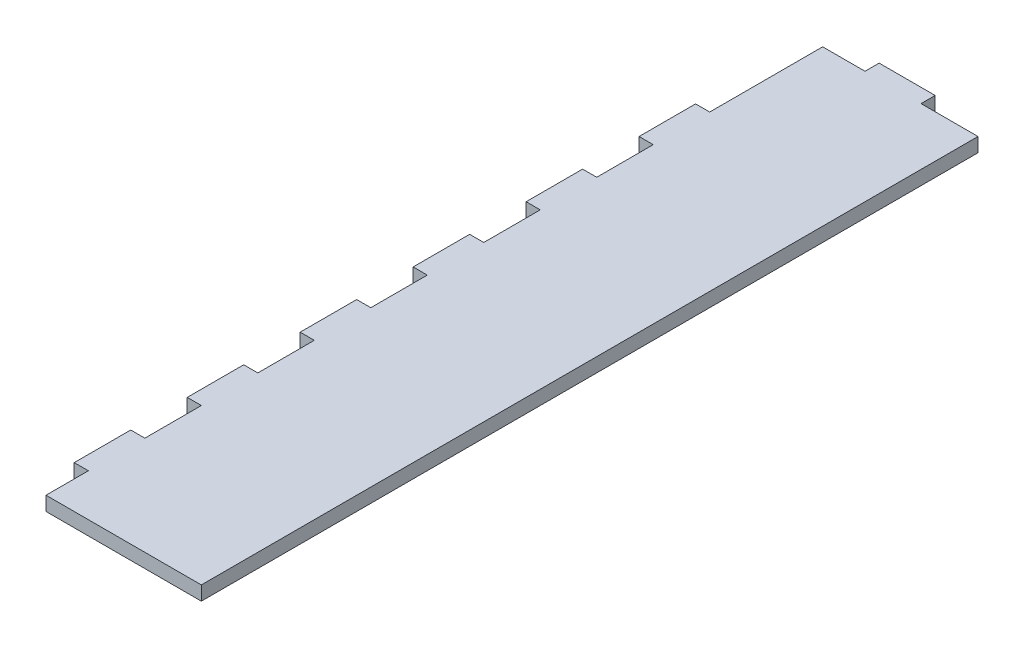
ISO-10303-21;
HEADER;
FILE_DESCRIPTION(('STEP AP214'),'2;1');
FILE_NAME('part.step','',(''),(''),'','','');
FILE_SCHEMA(('AUTOMOTIVE_DESIGN { 1 0 10303 214 1 1 1 1 }'));
ENDSEC;
DATA;
#1=APPLICATION_CONTEXT('core data for automotive mechanical design processes');
#2=APPLICATION_PROTOCOL_DEFINITION('international standard','automotive_design',2000,#1);
#3=PRODUCT_CONTEXT('',#1,'mechanical');
#4=PRODUCT('Part','Part','',(#3));
#5=PRODUCT_RELATED_PRODUCT_CATEGORY('part','',(#4));
#6=PRODUCT_DEFINITION_FORMATION('','',#4);
#7=PRODUCT_DEFINITION_CONTEXT('part definition',#1,'design');
#8=PRODUCT_DEFINITION('design','',#6,#7);
#9=PRODUCT_DEFINITION_SHAPE('','',#8);
#10=(LENGTH_UNIT() NAMED_UNIT(*) SI_UNIT(.MILLI.,.METRE.));
#11=(NAMED_UNIT(*) PLANE_ANGLE_UNIT() SI_UNIT($,.RADIAN.));
#12=(NAMED_UNIT(*) SI_UNIT($,.STERADIAN.) SOLID_ANGLE_UNIT());
#13=UNCERTAINTY_MEASURE_WITH_UNIT(LENGTH_MEASURE(1.E-05),#10,'distance_accuracy_value','');
#14=(GEOMETRIC_REPRESENTATION_CONTEXT(3) GLOBAL_UNCERTAINTY_ASSIGNED_CONTEXT((#13)) GLOBAL_UNIT_ASSIGNED_CONTEXT((#10,
#11,#12)) REPRESENTATION_CONTEXT('',''));
#15=CARTESIAN_POINT('',(0.,0.,0.));
#16=DIRECTION('',(0.,0.,1.));
#17=DIRECTION('',(1.,0.,0.));
#18=AXIS2_PLACEMENT_3D('',#15,#16,#17);
#19=CARTESIAN_POINT('',(-19.05,3.175,88.9));
#20=DIRECTION('',(1.,0.,0.));
#21=DIRECTION('',(0.,0.,-1.));
#22=AXIS2_PLACEMENT_3D('',#19,#20,#21);
#23=PLANE('',#22);
#24=DIRECTION('',(0.,0.,1.));
#25=VECTOR('',#24,1.);
#26=CARTESIAN_POINT('',(-19.05,0.,88.9));
#27=LINE('',#26,#25);
#28=CARTESIAN_POINT('',(-19.05,0.,-60.3249999999999));
#29=VERTEX_POINT('',#28);
#30=CARTESIAN_POINT('',(-19.05,0.,-47.6249999999999));
#31=VERTEX_POINT('',#30);
#32=EDGE_CURVE('E273',#29,#31,#27,.T.);
#33=ORIENTED_EDGE('',*,*,#32,.T.);
#34=DIRECTION('',(0.,1.,0.));
#35=VECTOR('',#34,1.);
#36=CARTESIAN_POINT('',(-19.05,0.,-47.6249999999999));
#37=LINE('',#36,#35);
#38=CARTESIAN_POINT('',(-19.05,3.175,-47.6249999999999));
#39=VERTEX_POINT('',#38);
#40=EDGE_CURVE('E382',#31,#39,#37,.T.);
#41=ORIENTED_EDGE('',*,*,#40,.T.);
#42=DIRECTION('',(0.,0.,1.));
#43=VECTOR('',#42,1.);
#44=CARTESIAN_POINT('',(-19.05,3.175,88.9));
#45=LINE('',#44,#43);
#46=CARTESIAN_POINT('',(-19.05,3.175,-60.3249999999999));
#47=VERTEX_POINT('',#46);
#48=EDGE_CURVE('E296',#47,#39,#45,.T.);
#49=ORIENTED_EDGE('',*,*,#48,.F.);
#50=DIRECTION('',(0.,1.,0.));
#51=VECTOR('',#50,1.);
#52=CARTESIAN_POINT('',(-19.05,0.,-60.3249999999999));
#53=LINE('',#52,#51);
#54=EDGE_CURVE('E470',#29,#47,#53,.T.);
#55=ORIENTED_EDGE('',*,*,#54,.F.);
#56=EDGE_LOOP('',(#33,#41,#49,#55));
#57=FACE_BOUND('',#56,.T.);
#58=ADVANCED_FACE('F33',(#57),#23,.F.);
#59=CARTESIAN_POINT('',(-19.05,3.175,-34.9249999999999));
#60=VERTEX_POINT('',#59);
#61=CARTESIAN_POINT('',(-19.0499999999997,3.175,-22.2249999999999));
#62=VERTEX_POINT('',#61);
#63=EDGE_CURVE('E307',#60,#62,#45,.T.);
#64=ORIENTED_EDGE('',*,*,#63,.F.);
#65=DIRECTION('',(0.,1.,0.));
#66=VECTOR('',#65,1.);
#67=CARTESIAN_POINT('',(-19.05,0.,-34.9249999999999));
#68=LINE('',#67,#66);
#69=CARTESIAN_POINT('',(-19.05,0.,-34.9249999999999));
#70=VERTEX_POINT('',#69);
#71=EDGE_CURVE('E399',#70,#60,#68,.T.);
#72=ORIENTED_EDGE('',*,*,#71,.F.);
#73=CARTESIAN_POINT('',(-19.0499999999997,0.,-22.2249999999999));
#74=VERTEX_POINT('',#73);
#75=EDGE_CURVE('E269',#70,#74,#27,.T.);
#76=ORIENTED_EDGE('',*,*,#75,.T.);
#77=DIRECTION('',(0.,1.,0.));
#78=VECTOR('',#77,1.);
#79=CARTESIAN_POINT('',(-19.0499999999997,0.,-22.2249999999999));
#80=LINE('',#79,#78);
#81=EDGE_CURVE('E442',#74,#62,#80,.T.);
#82=ORIENTED_EDGE('',*,*,#81,.T.);
#83=EDGE_LOOP('',(#64,#72,#76,#82));
#84=FACE_BOUND('',#83,.T.);
#85=ADVANCED_FACE('F503',(#84),#23,.F.);
#86=CARTESIAN_POINT('',(-19.0499999999997,3.175,-9.52499999999994));
#87=VERTEX_POINT('',#86);
#88=CARTESIAN_POINT('',(-19.0499999999995,3.175,3.17500000000005));
#89=VERTEX_POINT('',#88);
#90=EDGE_CURVE('E313',#87,#89,#45,.T.);
#91=ORIENTED_EDGE('',*,*,#90,.F.);
#92=DIRECTION('',(0.,1.,0.));
#93=VECTOR('',#92,1.);
#94=CARTESIAN_POINT('',(-19.0499999999997,0.,-9.52499999999994));
#95=LINE('',#94,#93);
#96=CARTESIAN_POINT('',(-19.0499999999997,0.,-9.52499999999994));
#97=VERTEX_POINT('',#96);
#98=EDGE_CURVE('E268',#97,#87,#95,.T.);
#99=ORIENTED_EDGE('',*,*,#98,.F.);
#100=CARTESIAN_POINT('',(-19.0499999999995,0.,3.17500000000005));
#101=VERTEX_POINT('',#100);
#102=EDGE_CURVE('E261',#97,#101,#27,.T.);
#103=ORIENTED_EDGE('',*,*,#102,.T.);
#104=DIRECTION('',(0.,1.,0.));
#105=VECTOR('',#104,1.);
#106=CARTESIAN_POINT('',(-19.0499999999995,0.,3.17500000000005));
#107=LINE('',#106,#105);
#108=EDGE_CURVE('E242',#101,#89,#107,.T.);
#109=ORIENTED_EDGE('',*,*,#108,.T.);
#110=EDGE_LOOP('',(#91,#99,#103,#109));
#111=FACE_BOUND('',#110,.T.);
#112=ADVANCED_FACE('F267',(#111),#23,.F.);
#113=CARTESIAN_POINT('',(-19.0499999999995,3.175,15.8750000000001));
#114=VERTEX_POINT('',#113);
#115=CARTESIAN_POINT('',(-19.0499999999992,3.175,28.575));
#116=VERTEX_POINT('',#115);
#117=EDGE_CURVE('E302',#114,#116,#45,.T.);
#118=ORIENTED_EDGE('',*,*,#117,.F.);
#119=DIRECTION('',(0.,1.,0.));
#120=VECTOR('',#119,1.);
#121=CARTESIAN_POINT('',(-19.0499999999995,0.,15.8750000000001));
#122=LINE('',#121,#120);
#123=CARTESIAN_POINT('',(-19.0499999999995,0.,15.8750000000001));
#124=VERTEX_POINT('',#123);
#125=EDGE_CURVE('E253',#124,#114,#122,.T.);
#126=ORIENTED_EDGE('',*,*,#125,.F.);
#127=CARTESIAN_POINT('',(-19.0499999999992,0.,28.575));
#128=VERTEX_POINT('',#127);
#129=EDGE_CURVE('E270',#124,#128,#27,.T.);
#130=ORIENTED_EDGE('',*,*,#129,.T.);
#131=DIRECTION('',(0.,1.,0.));
#132=VECTOR('',#131,1.);
#133=CARTESIAN_POINT('',(-19.0499999999992,0.,28.575));
#134=LINE('',#133,#132);
#135=EDGE_CURVE('E334',#128,#116,#134,.T.);
#136=ORIENTED_EDGE('',*,*,#135,.T.);
#137=EDGE_LOOP('',(#118,#126,#130,#136));
#138=FACE_BOUND('',#137,.T.);
#139=ADVANCED_FACE('F332',(#138),#23,.F.);
#140=CARTESIAN_POINT('',(-19.0499999999992,3.175,41.275));
#141=VERTEX_POINT('',#140);
#142=CARTESIAN_POINT('',(-19.0499999999989,3.175,53.9750000000001));
#143=VERTEX_POINT('',#142);
#144=EDGE_CURVE('E294',#141,#143,#45,.T.);
#145=ORIENTED_EDGE('',*,*,#144,.F.);
#146=DIRECTION('',(0.,1.,0.));
#147=VECTOR('',#146,1.);
#148=CARTESIAN_POINT('',(-19.0499999999992,0.,41.275));
#149=LINE('',#148,#147);
#150=CARTESIAN_POINT('',(-19.0499999999992,0.,41.275));
#151=VERTEX_POINT('',#150);
#152=EDGE_CURVE('E338',#151,#141,#149,.T.);
#153=ORIENTED_EDGE('',*,*,#152,.F.);
#154=CARTESIAN_POINT('',(-19.0499999999989,0.,53.9750000000001));
#155=VERTEX_POINT('',#154);
#156=EDGE_CURVE('E275',#151,#155,#27,.T.);
#157=ORIENTED_EDGE('',*,*,#156,.T.);
#158=DIRECTION('',(0.,1.,0.));
#159=VECTOR('',#158,1.);
#160=CARTESIAN_POINT('',(-19.0499999999989,0.,53.9750000000001));
#161=LINE('',#160,#159);
#162=EDGE_CURVE('E358',#155,#143,#161,.T.);
#163=ORIENTED_EDGE('',*,*,#162,.T.);
#164=EDGE_LOOP('',(#145,#153,#157,#163));
#165=FACE_BOUND('',#164,.T.);
#166=ADVANCED_FACE('F531',(#165),#23,.F.);
#167=CARTESIAN_POINT('',(-19.0499999999989,0.,66.6750000000001));
#168=VERTEX_POINT('',#167);
#169=CARTESIAN_POINT('',(-19.0499999999987,0.,79.3750000000001));
#170=VERTEX_POINT('',#169);
#171=EDGE_CURVE('E276',#168,#170,#27,.T.);
#172=ORIENTED_EDGE('',*,*,#171,.T.);
#173=DIRECTION('',(0.,1.,0.));
#174=VECTOR('',#173,1.);
#175=CARTESIAN_POINT('',(-19.0499999999987,0.,79.3750000000001));
#176=LINE('',#175,#174);
#177=CARTESIAN_POINT('',(-19.0499999999987,3.175,79.3750000000001));
#178=VERTEX_POINT('',#177);
#179=EDGE_CURVE('E404',#170,#178,#176,.T.);
#180=ORIENTED_EDGE('',*,*,#179,.T.);
#181=CARTESIAN_POINT('',(-19.0499999999989,3.175,66.6750000000001));
#182=VERTEX_POINT('',#181);
#183=EDGE_CURVE('E288',#182,#178,#45,.T.);
#184=ORIENTED_EDGE('',*,*,#183,.F.);
#185=DIRECTION('',(0.,1.,0.));
#186=VECTOR('',#185,1.);
#187=CARTESIAN_POINT('',(-19.0499999999989,0.,66.6750000000001));
#188=LINE('',#187,#186);
#189=EDGE_CURVE('E370',#168,#182,#188,.T.);
#190=ORIENTED_EDGE('',*,*,#189,.F.);
#191=EDGE_LOOP('',(#172,#180,#184,#190));
#192=FACE_BOUND('',#191,.T.);
#193=ADVANCED_FACE('F35',(#192),#23,.F.);
#194=CARTESIAN_POINT('',(19.05,3.175,88.9));
#195=DIRECTION('',(0.,0.,-1.));
#196=DIRECTION('',(-1.,0.,0.));
#197=AXIS2_PLACEMENT_3D('',#194,#195,#196);
#198=PLANE('',#197);
#199=DIRECTION('',(1.,0.,0.));
#200=VECTOR('',#199,1.);
#201=CARTESIAN_POINT('',(19.05,3.175,88.9));
#202=LINE('',#201,#200);
#203=CARTESIAN_POINT('',(-15.8749999999987,3.175,88.9));
#204=VERTEX_POINT('',#203);
#205=CARTESIAN_POINT('',(19.05,3.175,88.9));
#206=VERTEX_POINT('',#205);
#207=EDGE_CURVE('E306',#204,#206,#202,.T.);
#208=ORIENTED_EDGE('',*,*,#207,.F.);
#209=DIRECTION('',(0.,1.,0.));
#210=VECTOR('',#209,1.);
#211=CARTESIAN_POINT('',(-15.8749999999987,0.,88.9));
#212=LINE('',#211,#210);
#213=CARTESIAN_POINT('',(-15.8749999999987,0.,88.9));
#214=VERTEX_POINT('',#213);
#215=EDGE_CURVE('E422',#214,#204,#212,.T.);
#216=ORIENTED_EDGE('',*,*,#215,.F.);
#217=DIRECTION('',(1.,0.,0.));
#218=VECTOR('',#217,1.);
#219=CARTESIAN_POINT('',(19.05,0.,88.9));
#220=LINE('',#219,#218);
#221=CARTESIAN_POINT('',(19.05,0.,88.9));
#222=VERTEX_POINT('',#221);
#223=EDGE_CURVE('E282',#214,#222,#220,.T.);
#224=ORIENTED_EDGE('',*,*,#223,.T.);
#225=DIRECTION('',(0.,-1.,0.));
#226=VECTOR('',#225,1.);
#227=CARTESIAN_POINT('',(19.05,3.175,88.9));
#228=LINE('',#227,#226);
#229=EDGE_CURVE('E11',#206,#222,#228,.T.);
#230=ORIENTED_EDGE('',*,*,#229,.F.);
#231=EDGE_LOOP('',(#208,#216,#224,#230));
#232=FACE_BOUND('',#231,.T.);
#233=ADVANCED_FACE('F530',(#232),#198,.F.);
#234=CARTESIAN_POINT('',(19.05,3.175,88.9));
#235=DIRECTION('',(-1.,0.,0.));
#236=DIRECTION('',(0.,0.,1.));
#237=AXIS2_PLACEMENT_3D('',#234,#235,#236);
#238=PLANE('',#237);
#239=DIRECTION('',(0.,0.,-1.));
#240=VECTOR('',#239,1.);
#241=CARTESIAN_POINT('',(19.05,0.,88.9));
#242=LINE('',#241,#240);
#243=CARTESIAN_POINT('',(19.05,0.,-85.725));
#244=VERTEX_POINT('',#243);
#245=EDGE_CURVE('E284',#222,#244,#242,.T.);
#246=ORIENTED_EDGE('',*,*,#245,.T.);
#247=DIRECTION('',(0.,1.,0.));
#248=VECTOR('',#247,1.);
#249=CARTESIAN_POINT('',(19.05,0.,-85.725));
#250=LINE('',#249,#248);
#251=CARTESIAN_POINT('',(19.05,3.175,-85.725));
#252=VERTEX_POINT('',#251);
#253=EDGE_CURVE('E384',#244,#252,#250,.T.);
#254=ORIENTED_EDGE('',*,*,#253,.T.);
#255=DIRECTION('',(0.,0.,-1.));
#256=VECTOR('',#255,1.);
#257=CARTESIAN_POINT('',(19.05,3.175,88.9));
#258=LINE('',#257,#256);
#259=EDGE_CURVE('E311',#206,#252,#258,.T.);
#260=ORIENTED_EDGE('',*,*,#259,.F.);
#261=ORIENTED_EDGE('',*,*,#229,.T.);
#262=EDGE_LOOP('',(#246,#254,#260,#261));
#263=FACE_BOUND('',#262,.T.);
#264=ADVANCED_FACE('F537',(#263),#238,.F.);
#265=CARTESIAN_POINT('',(19.05,3.175,-88.8999999999999));
#266=DIRECTION('',(0.,0.,1.));
#267=DIRECTION('',(1.,0.,0.));
#268=AXIS2_PLACEMENT_3D('',#265,#266,#267);
#269=PLANE('',#268);
#270=DIRECTION('',(-1.,0.,0.));
#271=VECTOR('',#270,1.);
#272=CARTESIAN_POINT('',(19.05,3.175,-88.8999999999999));
#273=LINE('',#272,#271);
#274=CARTESIAN_POINT('',(6.24073442661703,3.175,-88.8999999999999));
#275=VERTEX_POINT('',#274);
#276=CARTESIAN_POINT('',(-6.34999999999999,3.175,-88.8999999999999));
#277=VERTEX_POINT('',#276);
#278=EDGE_CURVE('E41',#275,#277,#273,.T.);
#279=ORIENTED_EDGE('',*,*,#278,.F.);
#280=DIRECTION('',(0.,1.,0.));
#281=VECTOR('',#280,1.);
#282=CARTESIAN_POINT('',(6.24073442661703,0.,-88.8999999999999));
#283=LINE('',#282,#281);
#284=CARTESIAN_POINT('',(6.24073442661703,0.,-88.8999999999999));
#285=VERTEX_POINT('',#284);
#286=EDGE_CURVE('E378',#285,#275,#283,.T.);
#287=ORIENTED_EDGE('',*,*,#286,.F.);
#288=DIRECTION('',(-1.,0.,0.));
#289=VECTOR('',#288,1.);
#290=CARTESIAN_POINT('',(19.05,0.,-88.8999999999999));
#291=LINE('',#290,#289);
#292=CARTESIAN_POINT('',(-6.34999999999999,0.,-88.8999999999999));
#293=VERTEX_POINT('',#292);
#294=EDGE_CURVE('E286',#285,#293,#291,.T.);
#295=ORIENTED_EDGE('',*,*,#294,.T.);
#296=DIRECTION('',(0.,1.,0.));
#297=VECTOR('',#296,1.);
#298=CARTESIAN_POINT('',(-6.34999999999999,0.,-88.8999999999999));
#299=LINE('',#298,#297);
#300=EDGE_CURVE('E280',#293,#277,#299,.T.);
#301=ORIENTED_EDGE('',*,*,#300,.T.);
#302=EDGE_LOOP('',(#279,#287,#295,#301));
#303=FACE_BOUND('',#302,.T.);
#304=ADVANCED_FACE('F557',(#303),#269,.F.);
#305=CARTESIAN_POINT('',(0.,3.175,0.));
#306=DIRECTION('',(0.,1.,0.));
#307=DIRECTION('',(0.,0.,1.));
#308=AXIS2_PLACEMENT_3D('',#305,#306,#307);
#309=PLANE('',#308);
#310=DIRECTION('',(1.,0.,0.));
#311=VECTOR('',#310,1.);
#312=CARTESIAN_POINT('',(6.24073442661703,3.175,-85.725));
#313=LINE('',#312,#311);
#314=CARTESIAN_POINT('',(6.24073442661703,3.175,-85.725));
#315=VERTEX_POINT('',#314);
#316=EDGE_CURVE('E376',#315,#252,#313,.T.);
#317=ORIENTED_EDGE('',*,*,#316,.F.);
#318=DIRECTION('',(0.,0.,1.));
#319=VECTOR('',#318,1.);
#320=CARTESIAN_POINT('',(6.24073442661703,3.175,-88.8999999999999));
#321=LINE('',#320,#319);
#322=EDGE_CURVE('E379',#275,#315,#321,.T.);
#323=ORIENTED_EDGE('',*,*,#322,.F.);
#324=ORIENTED_EDGE('',*,*,#278,.T.);
#325=DIRECTION('',(0.,0.,-1.));
#326=VECTOR('',#325,1.);
#327=CARTESIAN_POINT('',(-6.34999999999999,3.175,-88.8999999999999));
#328=LINE('',#327,#326);
#329=CARTESIAN_POINT('',(-6.34999999999999,3.175,-85.725));
#330=VERTEX_POINT('',#329);
#331=EDGE_CURVE('E461',#330,#277,#328,.T.);
#332=ORIENTED_EDGE('',*,*,#331,.F.);
#333=DIRECTION('',(1.,0.,0.));
#334=VECTOR('',#333,1.);
#335=CARTESIAN_POINT('',(-6.34999999999999,3.175,-85.725));
#336=LINE('',#335,#334);
#337=CARTESIAN_POINT('',(-15.875,3.175,-85.7249999999999));
#338=VERTEX_POINT('',#337);
#339=EDGE_CURVE('E476',#338,#330,#336,.T.);
#340=ORIENTED_EDGE('',*,*,#339,.F.);
#341=DIRECTION('',(0.,0.,-1.));
#342=VECTOR('',#341,1.);
#343=CARTESIAN_POINT('',(-15.875,3.175,-85.7249999999999));
#344=LINE('',#343,#342);
#345=CARTESIAN_POINT('',(-15.875,3.175,-60.3249999999999));
#346=VERTEX_POINT('',#345);
#347=EDGE_CURVE('E473',#346,#338,#344,.T.);
#348=ORIENTED_EDGE('',*,*,#347,.F.);
#349=DIRECTION('',(1.,0.,0.));
#350=VECTOR('',#349,1.);
#351=CARTESIAN_POINT('',(-19.05,3.175,-60.3249999999999));
#352=LINE('',#351,#350);
#353=EDGE_CURVE('E387',#47,#346,#352,.T.);
#354=ORIENTED_EDGE('',*,*,#353,.F.);
#355=ORIENTED_EDGE('',*,*,#48,.T.);
#356=DIRECTION('',(-1.,0.,0.));
#357=VECTOR('',#356,1.);
#358=CARTESIAN_POINT('',(-19.05,3.175,-47.6249999999999));
#359=LINE('',#358,#357);
#360=CARTESIAN_POINT('',(-15.875,3.175,-47.6249999999999));
#361=VERTEX_POINT('',#360);
#362=EDGE_CURVE('E394',#361,#39,#359,.T.);
#363=ORIENTED_EDGE('',*,*,#362,.F.);
#364=DIRECTION('',(0.,0.,-1.));
#365=VECTOR('',#364,1.);
#366=CARTESIAN_POINT('',(-15.875,3.175,-47.6249999999999));
#367=LINE('',#366,#365);
#368=CARTESIAN_POINT('',(-15.875,3.175,-34.9249999999999));
#369=VERTEX_POINT('',#368);
#370=EDGE_CURVE('E403',#369,#361,#367,.T.);
#371=ORIENTED_EDGE('',*,*,#370,.F.);
#372=DIRECTION('',(1.,0.,0.));
#373=VECTOR('',#372,1.);
#374=CARTESIAN_POINT('',(-19.05,3.175,-34.9249999999999));
#375=LINE('',#374,#373);
#376=EDGE_CURVE('E400',#60,#369,#375,.T.);
#377=ORIENTED_EDGE('',*,*,#376,.F.);
#378=ORIENTED_EDGE('',*,*,#63,.T.);
#379=DIRECTION('',(-1.,0.,0.));
#380=VECTOR('',#379,1.);
#381=CARTESIAN_POINT('',(-19.0499999999997,3.175,-22.2249999999999));
#382=LINE('',#381,#380);
#383=CARTESIAN_POINT('',(-15.8749999999997,3.175,-22.2249999999999));
#384=VERTEX_POINT('',#383);
#385=EDGE_CURVE('E443',#384,#62,#382,.T.);
#386=ORIENTED_EDGE('',*,*,#385,.F.);
#387=DIRECTION('',(0.,0.,-1.));
#388=VECTOR('',#387,1.);
#389=CARTESIAN_POINT('',(-15.8749999999997,3.175,-22.2249999999999));
#390=LINE('',#389,#388);
#391=CARTESIAN_POINT('',(-15.8749999999997,3.175,-9.52499999999994));
#392=VERTEX_POINT('',#391);
#393=EDGE_CURVE('E437',#392,#384,#390,.T.);
#394=ORIENTED_EDGE('',*,*,#393,.F.);
#395=DIRECTION('',(1.,0.,0.));
#396=VECTOR('',#395,1.);
#397=CARTESIAN_POINT('',(-19.0499999999997,3.175,-9.52499999999994));
#398=LINE('',#397,#396);
#399=EDGE_CURVE('E445',#87,#392,#398,.T.);
#400=ORIENTED_EDGE('',*,*,#399,.F.);
#401=ORIENTED_EDGE('',*,*,#90,.T.);
#402=DIRECTION('',(-1.,0.,0.));
#403=VECTOR('',#402,1.);
#404=CARTESIAN_POINT('',(-19.0499999999995,3.175,3.17500000000005));
#405=LINE('',#404,#403);
#406=CARTESIAN_POINT('',(-15.8749999999995,3.175,3.17500000000005));
#407=VERTEX_POINT('',#406);
#408=EDGE_CURVE('E248',#407,#89,#405,.T.);
#409=ORIENTED_EDGE('',*,*,#408,.F.);
#410=DIRECTION('',(0.,0.,-1.));
#411=VECTOR('',#410,1.);
#412=CARTESIAN_POINT('',(-15.8749999999995,3.175,3.17500000000005));
#413=LINE('',#412,#411);
#414=CARTESIAN_POINT('',(-15.8749999999995,3.175,15.8750000000001));
#415=VERTEX_POINT('',#414);
#416=EDGE_CURVE('E264',#415,#407,#413,.T.);
#417=ORIENTED_EDGE('',*,*,#416,.F.);
#418=DIRECTION('',(1.,0.,0.));
#419=VECTOR('',#418,1.);
#420=CARTESIAN_POINT('',(-19.0499999999995,3.175,15.8750000000001));
#421=LINE('',#420,#419);
#422=EDGE_CURVE('E328',#114,#415,#421,.T.);
#423=ORIENTED_EDGE('',*,*,#422,.F.);
#424=ORIENTED_EDGE('',*,*,#117,.T.);
#425=DIRECTION('',(-1.,0.,0.));
#426=VECTOR('',#425,1.);
#427=CARTESIAN_POINT('',(-19.0499999999992,3.175,28.575));
#428=LINE('',#427,#426);
#429=CARTESIAN_POINT('',(-15.8749999999992,3.175,28.575));
#430=VERTEX_POINT('',#429);
#431=EDGE_CURVE('E325',#430,#116,#428,.T.);
#432=ORIENTED_EDGE('',*,*,#431,.F.);
#433=DIRECTION('',(0.,0.,-1.));
#434=VECTOR('',#433,1.);
#435=CARTESIAN_POINT('',(-15.8749999999992,3.175,28.575));
#436=LINE('',#435,#434);
#437=CARTESIAN_POINT('',(-15.8749999999992,3.175,41.275));
#438=VERTEX_POINT('',#437);
#439=EDGE_CURVE('E801',#438,#430,#436,.T.);
#440=ORIENTED_EDGE('',*,*,#439,.F.);
#441=DIRECTION('',(1.,0.,0.));
#442=VECTOR('',#441,1.);
#443=CARTESIAN_POINT('',(-19.0499999999992,3.175,41.275));
#444=LINE('',#443,#442);
#445=EDGE_CURVE('E805',#141,#438,#444,.T.);
#446=ORIENTED_EDGE('',*,*,#445,.F.);
#447=ORIENTED_EDGE('',*,*,#144,.T.);
#448=DIRECTION('',(-1.,0.,0.));
#449=VECTOR('',#448,1.);
#450=CARTESIAN_POINT('',(-19.0499999999989,3.175,53.9750000000001));
#451=LINE('',#450,#449);
#452=CARTESIAN_POINT('',(-15.8749999999989,3.175,53.9750000000001));
#453=VERTEX_POINT('',#452);
#454=EDGE_CURVE('E359',#453,#143,#451,.T.);
#455=ORIENTED_EDGE('',*,*,#454,.F.);
#456=DIRECTION('',(0.,0.,-1.));
#457=VECTOR('',#456,1.);
#458=CARTESIAN_POINT('',(-15.8749999999989,3.175,53.9750000000001));
#459=LINE('',#458,#457);
#460=CARTESIAN_POINT('',(-15.8749999999989,3.175,66.6750000000001));
#461=VERTEX_POINT('',#460);
#462=EDGE_CURVE('E352',#461,#453,#459,.T.);
#463=ORIENTED_EDGE('',*,*,#462,.F.);
#464=DIRECTION('',(1.,0.,0.));
#465=VECTOR('',#464,1.);
#466=CARTESIAN_POINT('',(-19.0499999999989,3.175,66.6750000000001));
#467=LINE('',#466,#465);
#468=EDGE_CURVE('E361',#182,#461,#467,.T.);
#469=ORIENTED_EDGE('',*,*,#468,.F.);
#470=ORIENTED_EDGE('',*,*,#183,.T.);
#471=DIRECTION('',(-1.,0.,0.));
#472=VECTOR('',#471,1.);
#473=CARTESIAN_POINT('',(-19.0499999999987,3.175,79.3750000000001));
#474=LINE('',#473,#472);
#475=CARTESIAN_POINT('',(-15.8749999999987,3.175,79.3750000000001));
#476=VERTEX_POINT('',#475);
#477=EDGE_CURVE('E419',#476,#178,#474,.T.);
#478=ORIENTED_EDGE('',*,*,#477,.F.);
#479=DIRECTION('',(0.,0.,-1.));
#480=VECTOR('',#479,1.);
#481=CARTESIAN_POINT('',(-15.8749999999987,3.175,79.3750000000001));
#482=LINE('',#481,#480);
#483=EDGE_CURVE('E423',#204,#476,#482,.T.);
#484=ORIENTED_EDGE('',*,*,#483,.F.);
#485=ORIENTED_EDGE('',*,*,#207,.T.);
#486=ORIENTED_EDGE('',*,*,#259,.T.);
#487=EDGE_LOOP('',(#317,#323,#324,#332,#340,#348,#354,#355,#363,#371,#377,#378,#386,#394,#400,
#401,#409,#417,#423,#424,#432,#440,#446,#447,#455,#463,#469,#470,#478,#484,#485,#486));
#488=FACE_BOUND('',#487,.T.);
#489=ADVANCED_FACE('F323',(#488),#309,.T.);
#490=CARTESIAN_POINT('',(0.,0.,0.));
#491=DIRECTION('',(0.,1.,0.));
#492=DIRECTION('',(0.,0.,1.));
#493=AXIS2_PLACEMENT_3D('',#490,#491,#492);
#494=PLANE('',#493);
#495=DIRECTION('',(0.,0.,1.));
#496=VECTOR('',#495,1.);
#497=CARTESIAN_POINT('',(6.24073442661703,0.,-88.8999999999999));
#498=LINE('',#497,#496);
#499=CARTESIAN_POINT('',(6.24073442661703,0.,-85.725));
#500=VERTEX_POINT('',#499);
#501=EDGE_CURVE('E374',#285,#500,#498,.T.);
#502=ORIENTED_EDGE('',*,*,#501,.T.);
#503=DIRECTION('',(1.,0.,0.));
#504=VECTOR('',#503,1.);
#505=CARTESIAN_POINT('',(6.24073442661703,0.,-85.725));
#506=LINE('',#505,#504);
#507=EDGE_CURVE('E48',#500,#244,#506,.T.);
#508=ORIENTED_EDGE('',*,*,#507,.T.);
#509=ORIENTED_EDGE('',*,*,#245,.F.);
#510=ORIENTED_EDGE('',*,*,#223,.F.);
#511=DIRECTION('',(0.,0.,-1.));
#512=VECTOR('',#511,1.);
#513=CARTESIAN_POINT('',(-15.8749999999987,0.,79.3750000000001));
#514=LINE('',#513,#512);
#515=CARTESIAN_POINT('',(-15.8749999999987,0.,79.3750000000001));
#516=VERTEX_POINT('',#515);
#517=EDGE_CURVE('E415',#214,#516,#514,.T.);
#518=ORIENTED_EDGE('',*,*,#517,.T.);
#519=DIRECTION('',(-1.,0.,0.));
#520=VECTOR('',#519,1.);
#521=CARTESIAN_POINT('',(-19.0499999999987,0.,79.3750000000001));
#522=LINE('',#521,#520);
#523=EDGE_CURVE('E418',#516,#170,#522,.T.);
#524=ORIENTED_EDGE('',*,*,#523,.T.);
#525=ORIENTED_EDGE('',*,*,#171,.F.);
#526=DIRECTION('',(1.,0.,0.));
#527=VECTOR('',#526,1.);
#528=CARTESIAN_POINT('',(-19.0499999999989,0.,66.6750000000001));
#529=LINE('',#528,#527);
#530=CARTESIAN_POINT('',(-15.8749999999989,0.,66.6750000000001));
#531=VERTEX_POINT('',#530);
#532=EDGE_CURVE('E351',#168,#531,#529,.T.);
#533=ORIENTED_EDGE('',*,*,#532,.T.);
#534=DIRECTION('',(0.,0.,-1.));
#535=VECTOR('',#534,1.);
#536=CARTESIAN_POINT('',(-15.8749999999989,0.,53.9750000000001));
#537=LINE('',#536,#535);
#538=CARTESIAN_POINT('',(-15.8749999999989,0.,53.9750000000001));
#539=VERTEX_POINT('',#538);
#540=EDGE_CURVE('E355',#531,#539,#537,.T.);
#541=ORIENTED_EDGE('',*,*,#540,.T.);
#542=DIRECTION('',(-1.,0.,0.));
#543=VECTOR('',#542,1.);
#544=CARTESIAN_POINT('',(-19.0499999999989,0.,53.9750000000001));
#545=LINE('',#544,#543);
#546=EDGE_CURVE('E348',#539,#155,#545,.T.);
#547=ORIENTED_EDGE('',*,*,#546,.T.);
#548=ORIENTED_EDGE('',*,*,#156,.F.);
#549=DIRECTION('',(1.,0.,0.));
#550=VECTOR('',#549,1.);
#551=CARTESIAN_POINT('',(-19.0499999999992,0.,41.275));
#552=LINE('',#551,#550);
#553=CARTESIAN_POINT('',(-15.8749999999992,0.,41.275));
#554=VERTEX_POINT('',#553);
#555=EDGE_CURVE('E344',#151,#554,#552,.T.);
#556=ORIENTED_EDGE('',*,*,#555,.T.);
#557=DIRECTION('',(0.,0.,-1.));
#558=VECTOR('',#557,1.);
#559=CARTESIAN_POINT('',(-15.8749999999992,0.,28.575));
#560=LINE('',#559,#558);
#561=CARTESIAN_POINT('',(-15.8749999999992,0.,28.575));
#562=VERTEX_POINT('',#561);
#563=EDGE_CURVE('E339',#554,#562,#560,.T.);
#564=ORIENTED_EDGE('',*,*,#563,.T.);
#565=DIRECTION('',(-1.,0.,0.));
#566=VECTOR('',#565,1.);
#567=CARTESIAN_POINT('',(-19.0499999999992,0.,28.575));
#568=LINE('',#567,#566);
#569=EDGE_CURVE('E799',#562,#128,#568,.T.);
#570=ORIENTED_EDGE('',*,*,#569,.T.);
#571=ORIENTED_EDGE('',*,*,#129,.F.);
#572=DIRECTION('',(1.,0.,0.));
#573=VECTOR('',#572,1.);
#574=CARTESIAN_POINT('',(-19.0499999999995,0.,15.8750000000001));
#575=LINE('',#574,#573);
#576=CARTESIAN_POINT('',(-15.8749999999995,0.,15.8750000000001));
#577=VERTEX_POINT('',#576);
#578=EDGE_CURVE('E263',#124,#577,#575,.T.);
#579=ORIENTED_EDGE('',*,*,#578,.T.);
#580=DIRECTION('',(0.,0.,-1.));
#581=VECTOR('',#580,1.);
#582=CARTESIAN_POINT('',(-15.8749999999995,0.,3.17500000000005));
#583=LINE('',#582,#581);
#584=CARTESIAN_POINT('',(-15.8749999999995,0.,3.17500000000005));
#585=VERTEX_POINT('',#584);
#586=EDGE_CURVE('E254',#577,#585,#583,.T.);
#587=ORIENTED_EDGE('',*,*,#586,.T.);
#588=DIRECTION('',(-1.,0.,0.));
#589=VECTOR('',#588,1.);
#590=CARTESIAN_POINT('',(-19.0499999999995,0.,3.17500000000005));
#591=LINE('',#590,#589);
#592=EDGE_CURVE('E245',#585,#101,#591,.T.);
#593=ORIENTED_EDGE('',*,*,#592,.T.);
#594=ORIENTED_EDGE('',*,*,#102,.F.);
#595=DIRECTION('',(1.,0.,0.));
#596=VECTOR('',#595,1.);
#597=CARTESIAN_POINT('',(-19.0499999999997,0.,-9.52499999999994));
#598=LINE('',#597,#596);
#599=CARTESIAN_POINT('',(-15.8749999999997,0.,-9.52499999999994));
#600=VERTEX_POINT('',#599);
#601=EDGE_CURVE('E436',#97,#600,#598,.T.);
#602=ORIENTED_EDGE('',*,*,#601,.T.);
#603=DIRECTION('',(0.,0.,-1.));
#604=VECTOR('',#603,1.);
#605=CARTESIAN_POINT('',(-15.8749999999997,0.,-22.2249999999999));
#606=LINE('',#605,#604);
#607=CARTESIAN_POINT('',(-15.8749999999997,0.,-22.2249999999999));
#608=VERTEX_POINT('',#607);
#609=EDGE_CURVE('E439',#600,#608,#606,.T.);
#610=ORIENTED_EDGE('',*,*,#609,.T.);
#611=DIRECTION('',(-1.,0.,0.));
#612=VECTOR('',#611,1.);
#613=CARTESIAN_POINT('',(-19.0499999999997,0.,-22.2249999999999));
#614=LINE('',#613,#612);
#615=EDGE_CURVE('E433',#608,#74,#614,.T.);
#616=ORIENTED_EDGE('',*,*,#615,.T.);
#617=ORIENTED_EDGE('',*,*,#75,.F.);
#618=DIRECTION('',(1.,0.,0.));
#619=VECTOR('',#618,1.);
#620=CARTESIAN_POINT('',(-19.05,0.,-34.9249999999999));
#621=LINE('',#620,#619);
#622=CARTESIAN_POINT('',(-15.875,0.,-34.9249999999999));
#623=VERTEX_POINT('',#622);
#624=EDGE_CURVE('E391',#70,#623,#621,.T.);
#625=ORIENTED_EDGE('',*,*,#624,.T.);
#626=DIRECTION('',(0.,0.,-1.));
#627=VECTOR('',#626,1.);
#628=CARTESIAN_POINT('',(-15.875,0.,-47.6249999999999));
#629=LINE('',#628,#627);
#630=CARTESIAN_POINT('',(-15.875,0.,-47.6249999999999));
#631=VERTEX_POINT('',#630);
#632=EDGE_CURVE('E56',#623,#631,#629,.T.);
#633=ORIENTED_EDGE('',*,*,#632,.T.);
#634=DIRECTION('',(-1.,0.,0.));
#635=VECTOR('',#634,1.);
#636=CARTESIAN_POINT('',(-19.05,0.,-47.6249999999999));
#637=LINE('',#636,#635);
#638=EDGE_CURVE('E396',#631,#31,#637,.T.);
#639=ORIENTED_EDGE('',*,*,#638,.T.);
#640=ORIENTED_EDGE('',*,*,#32,.F.);
#641=DIRECTION('',(1.,0.,0.));
#642=VECTOR('',#641,1.);
#643=CARTESIAN_POINT('',(-19.05,0.,-60.3249999999999));
#644=LINE('',#643,#642);
#645=CARTESIAN_POINT('',(-15.875,0.,-60.3249999999999));
#646=VERTEX_POINT('',#645);
#647=EDGE_CURVE('E457',#29,#646,#644,.T.);
#648=ORIENTED_EDGE('',*,*,#647,.T.);
#649=DIRECTION('',(0.,0.,-1.));
#650=VECTOR('',#649,1.);
#651=CARTESIAN_POINT('',(-15.875,0.,-85.7249999999999));
#652=LINE('',#651,#650);
#653=CARTESIAN_POINT('',(-15.875,0.,-85.7249999999999));
#654=VERTEX_POINT('',#653);
#655=EDGE_CURVE('E460',#646,#654,#652,.T.);
#656=ORIENTED_EDGE('',*,*,#655,.T.);
#657=DIRECTION('',(1.,0.,0.));
#658=VECTOR('',#657,1.);
#659=CARTESIAN_POINT('',(-6.34999999999999,0.,-85.725));
#660=LINE('',#659,#658);
#661=CARTESIAN_POINT('',(-6.34999999999999,0.,-85.725));
#662=VERTEX_POINT('',#661);
#663=EDGE_CURVE('E464',#654,#662,#660,.T.);
#664=ORIENTED_EDGE('',*,*,#663,.T.);
#665=DIRECTION('',(0.,0.,-1.));
#666=VECTOR('',#665,1.);
#667=CARTESIAN_POINT('',(-6.34999999999999,0.,-88.8999999999999));
#668=LINE('',#667,#666);
#669=EDGE_CURVE('E467',#662,#293,#668,.T.);
#670=ORIENTED_EDGE('',*,*,#669,.T.);
#671=ORIENTED_EDGE('',*,*,#294,.F.);
#672=EDGE_LOOP('',(#502,#508,#509,#510,#518,#524,#525,#533,#541,#547,#548,#556,#564,#570,#571,
#579,#587,#593,#594,#602,#610,#616,#617,#625,#633,#639,#640,#648,#656,#664,#670,#671));
#673=FACE_BOUND('',#672,.T.);
#674=ADVANCED_FACE('F259',(#673),#494,.F.);
#675=CARTESIAN_POINT('',(-6.34999999999999,0.,-88.8999999999999));
#676=DIRECTION('',(1.,0.,0.));
#677=DIRECTION('',(0.,0.,-1.));
#678=AXIS2_PLACEMENT_3D('',#675,#676,#677);
#679=PLANE('',#678);
#680=ORIENTED_EDGE('',*,*,#331,.T.);
#681=ORIENTED_EDGE('',*,*,#300,.F.);
#682=ORIENTED_EDGE('',*,*,#669,.F.);
#683=DIRECTION('',(0.,1.,0.));
#684=VECTOR('',#683,1.);
#685=CARTESIAN_POINT('',(-6.34999999999999,0.,-85.725));
#686=LINE('',#685,#684);
#687=EDGE_CURVE('E481',#662,#330,#686,.T.);
#688=ORIENTED_EDGE('',*,*,#687,.T.);
#689=EDGE_LOOP('',(#680,#681,#682,#688));
#690=FACE_BOUND('',#689,.T.);
#691=ADVANCED_FACE('F560',(#690),#679,.F.);
#692=CARTESIAN_POINT('',(-6.34999999999999,0.,-85.725));
#693=DIRECTION('',(0.,0.,1.));
#694=DIRECTION('',(1.,0.,0.));
#695=AXIS2_PLACEMENT_3D('',#692,#693,#694);
#696=PLANE('',#695);
#697=ORIENTED_EDGE('',*,*,#339,.T.);
#698=ORIENTED_EDGE('',*,*,#687,.F.);
#699=ORIENTED_EDGE('',*,*,#663,.F.);
#700=DIRECTION('',(0.,1.,0.));
#701=VECTOR('',#700,1.);
#702=CARTESIAN_POINT('',(-15.875,0.,-85.7249999999999));
#703=LINE('',#702,#701);
#704=EDGE_CURVE('E483',#654,#338,#703,.T.);
#705=ORIENTED_EDGE('',*,*,#704,.T.);
#706=EDGE_LOOP('',(#697,#698,#699,#705));
#707=FACE_BOUND('',#706,.T.);
#708=ADVANCED_FACE('F563',(#707),#696,.F.);
#709=CARTESIAN_POINT('',(-15.875,0.,-85.7249999999999));
#710=DIRECTION('',(1.,0.,0.));
#711=DIRECTION('',(0.,0.,-1.));
#712=AXIS2_PLACEMENT_3D('',#709,#710,#711);
#713=PLANE('',#712);
#714=ORIENTED_EDGE('',*,*,#347,.T.);
#715=ORIENTED_EDGE('',*,*,#704,.F.);
#716=ORIENTED_EDGE('',*,*,#655,.F.);
#717=DIRECTION('',(0.,1.,0.));
#718=VECTOR('',#717,1.);
#719=CARTESIAN_POINT('',(-15.875,0.,-60.3249999999999));
#720=LINE('',#719,#718);
#721=EDGE_CURVE('E485',#646,#346,#720,.T.);
#722=ORIENTED_EDGE('',*,*,#721,.T.);
#723=EDGE_LOOP('',(#714,#715,#716,#722));
#724=FACE_BOUND('',#723,.T.);
#725=ADVANCED_FACE('F565',(#724),#713,.F.);
#726=CARTESIAN_POINT('',(-19.05,0.,-60.3249999999999));
#727=DIRECTION('',(0.,0.,1.));
#728=DIRECTION('',(1.,0.,0.));
#729=AXIS2_PLACEMENT_3D('',#726,#727,#728);
#730=PLANE('',#729);
#731=ORIENTED_EDGE('',*,*,#353,.T.);
#732=ORIENTED_EDGE('',*,*,#721,.F.);
#733=ORIENTED_EDGE('',*,*,#647,.F.);
#734=ORIENTED_EDGE('',*,*,#54,.T.);
#735=EDGE_LOOP('',(#731,#732,#733,#734));
#736=FACE_BOUND('',#735,.T.);
#737=ADVANCED_FACE('F488',(#736),#730,.F.);
#738=CARTESIAN_POINT('',(-19.0499999999989,0.,53.9750000000001));
#739=DIRECTION('',(0.,0.,-1.));
#740=DIRECTION('',(-1.,0.,0.));
#741=AXIS2_PLACEMENT_3D('',#738,#739,#740);
#742=PLANE('',#741);
#743=ORIENTED_EDGE('',*,*,#454,.T.);
#744=ORIENTED_EDGE('',*,*,#162,.F.);
#745=ORIENTED_EDGE('',*,*,#546,.F.);
#746=DIRECTION('',(0.,1.,0.));
#747=VECTOR('',#746,1.);
#748=CARTESIAN_POINT('',(-15.8749999999989,0.,53.9750000000001));
#749=LINE('',#748,#747);
#750=EDGE_CURVE('E366',#539,#453,#749,.T.);
#751=ORIENTED_EDGE('',*,*,#750,.T.);
#752=EDGE_LOOP('',(#743,#744,#745,#751));
#753=FACE_BOUND('',#752,.T.);
#754=ADVANCED_FACE('F572',(#753),#742,.F.);
#755=CARTESIAN_POINT('',(-15.8749999999989,0.,53.9750000000001));
#756=DIRECTION('',(1.,0.,0.));
#757=DIRECTION('',(0.,0.,-1.));
#758=AXIS2_PLACEMENT_3D('',#755,#756,#757);
#759=PLANE('',#758);
#760=ORIENTED_EDGE('',*,*,#462,.T.);
#761=ORIENTED_EDGE('',*,*,#750,.F.);
#762=ORIENTED_EDGE('',*,*,#540,.F.);
#763=DIRECTION('',(0.,1.,0.));
#764=VECTOR('',#763,1.);
#765=CARTESIAN_POINT('',(-15.8749999999989,0.,66.6750000000001));
#766=LINE('',#765,#764);
#767=EDGE_CURVE('E368',#531,#461,#766,.T.);
#768=ORIENTED_EDGE('',*,*,#767,.T.);
#769=EDGE_LOOP('',(#760,#761,#762,#768));
#770=FACE_BOUND('',#769,.T.);
#771=ADVANCED_FACE('F632',(#770),#759,.F.);
#772=CARTESIAN_POINT('',(-19.0499999999989,0.,66.6750000000001));
#773=DIRECTION('',(0.,0.,1.));
#774=DIRECTION('',(1.,0.,0.));
#775=AXIS2_PLACEMENT_3D('',#772,#773,#774);
#776=PLANE('',#775);
#777=ORIENTED_EDGE('',*,*,#468,.T.);
#778=ORIENTED_EDGE('',*,*,#767,.F.);
#779=ORIENTED_EDGE('',*,*,#532,.F.);
#780=ORIENTED_EDGE('',*,*,#189,.T.);
#781=EDGE_LOOP('',(#777,#778,#779,#780));
#782=FACE_BOUND('',#781,.T.);
#783=ADVANCED_FACE('F642',(#782),#776,.F.);
#784=CARTESIAN_POINT('',(-19.0499999999992,0.,28.575));
#785=DIRECTION('',(0.,0.,-1.));
#786=DIRECTION('',(-1.,0.,0.));
#787=AXIS2_PLACEMENT_3D('',#784,#785,#786);
#788=PLANE('',#787);
#789=ORIENTED_EDGE('',*,*,#431,.T.);
#790=ORIENTED_EDGE('',*,*,#135,.F.);
#791=ORIENTED_EDGE('',*,*,#569,.F.);
#792=DIRECTION('',(0.,1.,0.));
#793=VECTOR('',#792,1.);
#794=CARTESIAN_POINT('',(-15.8749999999992,0.,28.575));
#795=LINE('',#794,#793);
#796=EDGE_CURVE('E810',#562,#430,#795,.T.);
#797=ORIENTED_EDGE('',*,*,#796,.T.);
#798=EDGE_LOOP('',(#789,#790,#791,#797));
#799=FACE_BOUND('',#798,.T.);
#800=ADVANCED_FACE('F652',(#799),#788,.F.);
#801=CARTESIAN_POINT('',(-15.8749999999992,0.,28.575));
#802=DIRECTION('',(1.,0.,0.));
#803=DIRECTION('',(0.,0.,-1.));
#804=AXIS2_PLACEMENT_3D('',#801,#802,#803);
#805=PLANE('',#804);
#806=ORIENTED_EDGE('',*,*,#439,.T.);
#807=ORIENTED_EDGE('',*,*,#796,.F.);
#808=ORIENTED_EDGE('',*,*,#563,.F.);
#809=DIRECTION('',(0.,1.,0.));
#810=VECTOR('',#809,1.);
#811=CARTESIAN_POINT('',(-15.8749999999992,0.,41.275));
#812=LINE('',#811,#810);
#813=EDGE_CURVE('E341',#554,#438,#812,.T.);
#814=ORIENTED_EDGE('',*,*,#813,.T.);
#815=EDGE_LOOP('',(#806,#807,#808,#814));
#816=FACE_BOUND('',#815,.T.);
#817=ADVANCED_FACE('F662',(#816),#805,.F.);
#818=CARTESIAN_POINT('',(-19.0499999999992,0.,41.275));
#819=DIRECTION('',(0.,0.,1.));
#820=DIRECTION('',(1.,0.,0.));
#821=AXIS2_PLACEMENT_3D('',#818,#819,#820);
#822=PLANE('',#821);
#823=ORIENTED_EDGE('',*,*,#445,.T.);
#824=ORIENTED_EDGE('',*,*,#813,.F.);
#825=ORIENTED_EDGE('',*,*,#555,.F.);
#826=ORIENTED_EDGE('',*,*,#152,.T.);
#827=EDGE_LOOP('',(#823,#824,#825,#826));
#828=FACE_BOUND('',#827,.T.);
#829=ADVANCED_FACE('F671',(#828),#822,.F.);
#830=CARTESIAN_POINT('',(-19.0499999999995,0.,3.17500000000005));
#831=DIRECTION('',(0.,0.,-1.));
#832=DIRECTION('',(-1.,0.,0.));
#833=AXIS2_PLACEMENT_3D('',#830,#831,#832);
#834=PLANE('',#833);
#835=ORIENTED_EDGE('',*,*,#408,.T.);
#836=ORIENTED_EDGE('',*,*,#108,.F.);
#837=ORIENTED_EDGE('',*,*,#592,.F.);
#838=DIRECTION('',(0.,1.,0.));
#839=VECTOR('',#838,1.);
#840=CARTESIAN_POINT('',(-15.8749999999995,0.,3.17500000000005));
#841=LINE('',#840,#839);
#842=EDGE_CURVE('E446',#585,#407,#841,.T.);
#843=ORIENTED_EDGE('',*,*,#842,.T.);
#844=EDGE_LOOP('',(#835,#836,#837,#843));
#845=FACE_BOUND('',#844,.T.);
#846=ADVANCED_FACE('F244',(#845),#834,.F.);
#847=CARTESIAN_POINT('',(-15.8749999999995,0.,3.17500000000005));
#848=DIRECTION('',(1.,0.,0.));
#849=DIRECTION('',(0.,0.,-1.));
#850=AXIS2_PLACEMENT_3D('',#847,#848,#849);
#851=PLANE('',#850);
#852=ORIENTED_EDGE('',*,*,#416,.T.);
#853=ORIENTED_EDGE('',*,*,#842,.F.);
#854=ORIENTED_EDGE('',*,*,#586,.F.);
#855=DIRECTION('',(0.,1.,0.));
#856=VECTOR('',#855,1.);
#857=CARTESIAN_POINT('',(-15.8749999999995,0.,15.8750000000001));
#858=LINE('',#857,#856);
#859=EDGE_CURVE('E790',#577,#415,#858,.T.);
#860=ORIENTED_EDGE('',*,*,#859,.T.);
#861=EDGE_LOOP('',(#852,#853,#854,#860));
#862=FACE_BOUND('',#861,.T.);
#863=ADVANCED_FACE('F690',(#862),#851,.F.);
#864=CARTESIAN_POINT('',(-19.0499999999995,0.,15.8750000000001));
#865=DIRECTION('',(0.,0.,1.));
#866=DIRECTION('',(1.,0.,0.));
#867=AXIS2_PLACEMENT_3D('',#864,#865,#866);
#868=PLANE('',#867);
#869=ORIENTED_EDGE('',*,*,#422,.T.);
#870=ORIENTED_EDGE('',*,*,#859,.F.);
#871=ORIENTED_EDGE('',*,*,#578,.F.);
#872=ORIENTED_EDGE('',*,*,#125,.T.);
#873=EDGE_LOOP('',(#869,#870,#871,#872));
#874=FACE_BOUND('',#873,.T.);
#875=ADVANCED_FACE('F699',(#874),#868,.F.);
#876=CARTESIAN_POINT('',(-19.0499999999997,0.,-22.2249999999999));
#877=DIRECTION('',(0.,0.,-1.));
#878=DIRECTION('',(-1.,0.,0.));
#879=AXIS2_PLACEMENT_3D('',#876,#877,#878);
#880=PLANE('',#879);
#881=ORIENTED_EDGE('',*,*,#385,.T.);
#882=ORIENTED_EDGE('',*,*,#81,.F.);
#883=ORIENTED_EDGE('',*,*,#615,.F.);
#884=DIRECTION('',(0.,1.,0.));
#885=VECTOR('',#884,1.);
#886=CARTESIAN_POINT('',(-15.8749999999997,0.,-22.2249999999999));
#887=LINE('',#886,#885);
#888=EDGE_CURVE('E426',#608,#384,#887,.T.);
#889=ORIENTED_EDGE('',*,*,#888,.T.);
#890=EDGE_LOOP('',(#881,#882,#883,#889));
#891=FACE_BOUND('',#890,.T.);
#892=ADVANCED_FACE('F506',(#891),#880,.F.);
#893=CARTESIAN_POINT('',(-15.8749999999997,0.,-22.2249999999999));
#894=DIRECTION('',(1.,0.,0.));
#895=DIRECTION('',(0.,0.,-1.));
#896=AXIS2_PLACEMENT_3D('',#893,#894,#895);
#897=PLANE('',#896);
#898=ORIENTED_EDGE('',*,*,#393,.T.);
#899=ORIENTED_EDGE('',*,*,#888,.F.);
#900=ORIENTED_EDGE('',*,*,#609,.F.);
#901=DIRECTION('',(0.,1.,0.));
#902=VECTOR('',#901,1.);
#903=CARTESIAN_POINT('',(-15.8749999999997,0.,-9.52499999999994));
#904=LINE('',#903,#902);
#905=EDGE_CURVE('E452',#600,#392,#904,.T.);
#906=ORIENTED_EDGE('',*,*,#905,.T.);
#907=EDGE_LOOP('',(#898,#899,#900,#906));
#908=FACE_BOUND('',#907,.T.);
#909=ADVANCED_FACE('F509',(#908),#897,.F.);
#910=CARTESIAN_POINT('',(-19.0499999999997,0.,-9.52499999999994));
#911=DIRECTION('',(0.,0.,1.));
#912=DIRECTION('',(1.,0.,0.));
#913=AXIS2_PLACEMENT_3D('',#910,#911,#912);
#914=PLANE('',#913);
#915=ORIENTED_EDGE('',*,*,#399,.T.);
#916=ORIENTED_EDGE('',*,*,#905,.F.);
#917=ORIENTED_EDGE('',*,*,#601,.F.);
#918=ORIENTED_EDGE('',*,*,#98,.T.);
#919=EDGE_LOOP('',(#915,#916,#917,#918));
#920=FACE_BOUND('',#919,.T.);
#921=ADVANCED_FACE('F511',(#920),#914,.F.);
#922=CARTESIAN_POINT('',(-19.0499999999987,0.,79.3750000000001));
#923=DIRECTION('',(0.,0.,-1.));
#924=DIRECTION('',(-1.,0.,0.));
#925=AXIS2_PLACEMENT_3D('',#922,#923,#924);
#926=PLANE('',#925);
#927=ORIENTED_EDGE('',*,*,#477,.T.);
#928=ORIENTED_EDGE('',*,*,#179,.F.);
#929=ORIENTED_EDGE('',*,*,#523,.F.);
#930=DIRECTION('',(0.,1.,0.));
#931=VECTOR('',#930,1.);
#932=CARTESIAN_POINT('',(-15.8749999999987,0.,79.3750000000001));
#933=LINE('',#932,#931);
#934=EDGE_CURVE('E430',#516,#476,#933,.T.);
#935=ORIENTED_EDGE('',*,*,#934,.T.);
#936=EDGE_LOOP('',(#927,#928,#929,#935));
#937=FACE_BOUND('',#936,.T.);
#938=ADVANCED_FACE('F514',(#937),#926,.F.);
#939=CARTESIAN_POINT('',(-15.8749999999987,0.,79.3750000000001));
#940=DIRECTION('',(1.,0.,0.));
#941=DIRECTION('',(0.,0.,-1.));
#942=AXIS2_PLACEMENT_3D('',#939,#940,#941);
#943=PLANE('',#942);
#944=ORIENTED_EDGE('',*,*,#483,.T.);
#945=ORIENTED_EDGE('',*,*,#934,.F.);
#946=ORIENTED_EDGE('',*,*,#517,.F.);
#947=ORIENTED_EDGE('',*,*,#215,.T.);
#948=EDGE_LOOP('',(#944,#945,#946,#947));
#949=FACE_BOUND('',#948,.T.);
#950=ADVANCED_FACE('F520',(#949),#943,.F.);
#951=CARTESIAN_POINT('',(-19.05,0.,-47.6249999999999));
#952=DIRECTION('',(0.,0.,-1.));
#953=DIRECTION('',(-1.,0.,0.));
#954=AXIS2_PLACEMENT_3D('',#951,#952,#953);
#955=PLANE('',#954);
#956=ORIENTED_EDGE('',*,*,#362,.T.);
#957=ORIENTED_EDGE('',*,*,#40,.F.);
#958=ORIENTED_EDGE('',*,*,#638,.F.);
#959=DIRECTION('',(0.,1.,0.));
#960=VECTOR('',#959,1.);
#961=CARTESIAN_POINT('',(-15.875,0.,-47.6249999999999));
#962=LINE('',#961,#960);
#963=EDGE_CURVE('E410',#631,#361,#962,.T.);
#964=ORIENTED_EDGE('',*,*,#963,.T.);
#965=EDGE_LOOP('',(#956,#957,#958,#964));
#966=FACE_BOUND('',#965,.T.);
#967=ADVANCED_FACE('F497',(#966),#955,.F.);
#968=CARTESIAN_POINT('',(-15.875,0.,-47.6249999999999));
#969=DIRECTION('',(1.,0.,0.));
#970=DIRECTION('',(0.,0.,-1.));
#971=AXIS2_PLACEMENT_3D('',#968,#969,#970);
#972=PLANE('',#971);
#973=ORIENTED_EDGE('',*,*,#370,.T.);
#974=ORIENTED_EDGE('',*,*,#963,.F.);
#975=ORIENTED_EDGE('',*,*,#632,.F.);
#976=DIRECTION('',(0.,1.,0.));
#977=VECTOR('',#976,1.);
#978=CARTESIAN_POINT('',(-15.875,0.,-34.9249999999999));
#979=LINE('',#978,#977);
#980=EDGE_CURVE('E412',#623,#369,#979,.T.);
#981=ORIENTED_EDGE('',*,*,#980,.T.);
#982=EDGE_LOOP('',(#973,#974,#975,#981));
#983=FACE_BOUND('',#982,.T.);
#984=ADVANCED_FACE('F749',(#983),#972,.F.);
#985=CARTESIAN_POINT('',(-19.05,0.,-34.9249999999999));
#986=DIRECTION('',(0.,0.,1.));
#987=DIRECTION('',(1.,0.,0.));
#988=AXIS2_PLACEMENT_3D('',#985,#986,#987);
#989=PLANE('',#988);
#990=ORIENTED_EDGE('',*,*,#376,.T.);
#991=ORIENTED_EDGE('',*,*,#980,.F.);
#992=ORIENTED_EDGE('',*,*,#624,.F.);
#993=ORIENTED_EDGE('',*,*,#71,.T.);
#994=EDGE_LOOP('',(#990,#991,#992,#993));
#995=FACE_BOUND('',#994,.T.);
#996=ADVANCED_FACE('F501',(#995),#989,.F.);
#997=CARTESIAN_POINT('',(6.24073442661703,0.,-85.725));
#998=DIRECTION('',(0.,0.,1.));
#999=DIRECTION('',(1.,0.,0.));
#1000=AXIS2_PLACEMENT_3D('',#997,#998,#999);
#1001=PLANE('',#1000);
#1002=ORIENTED_EDGE('',*,*,#316,.T.);
#1003=ORIENTED_EDGE('',*,*,#253,.F.);
#1004=ORIENTED_EDGE('',*,*,#507,.F.);
#1005=DIRECTION('',(0.,1.,0.));
#1006=VECTOR('',#1005,1.);
#1007=CARTESIAN_POINT('',(6.24073442661703,0.,-85.725));
#1008=LINE('',#1007,#1006);
#1009=EDGE_CURVE('E388',#500,#315,#1008,.T.);
#1010=ORIENTED_EDGE('',*,*,#1009,.T.);
#1011=EDGE_LOOP('',(#1002,#1003,#1004,#1010));
#1012=FACE_BOUND('',#1011,.T.);
#1013=ADVANCED_FACE('F766',(#1012),#1001,.F.);
#1014=CARTESIAN_POINT('',(6.24073442661703,0.,-88.8999999999999));
#1015=DIRECTION('',(-1.,0.,0.));
#1016=DIRECTION('',(0.,0.,1.));
#1017=AXIS2_PLACEMENT_3D('',#1014,#1015,#1016);
#1018=PLANE('',#1017);
#1019=ORIENTED_EDGE('',*,*,#322,.T.);
#1020=ORIENTED_EDGE('',*,*,#1009,.F.);
#1021=ORIENTED_EDGE('',*,*,#501,.F.);
#1022=ORIENTED_EDGE('',*,*,#286,.T.);
#1023=EDGE_LOOP('',(#1019,#1020,#1021,#1022));
#1024=FACE_BOUND('',#1023,.T.);
#1025=ADVANCED_FACE('F775',(#1024),#1018,.F.);
#1026=CLOSED_SHELL('',(#58,#85,#112,#139,#166,#193,#233,#264,#304,#489,#674,#691,#708,#725,#737,
#754,#771,#783,#800,#817,#829,#846,#863,#875,#892,#909,#921,#938,#950,#967,#984,#996,#1013,#1025));
#1027=MANIFOLD_SOLID_BREP('B2',#1026);
#1028=ADVANCED_BREP_SHAPE_REPRESENTATION('',(#18,#1027),#14);
#1029=SHAPE_DEFINITION_REPRESENTATION(#9,#1028);
ENDSEC;
END-ISO-10303-21;
